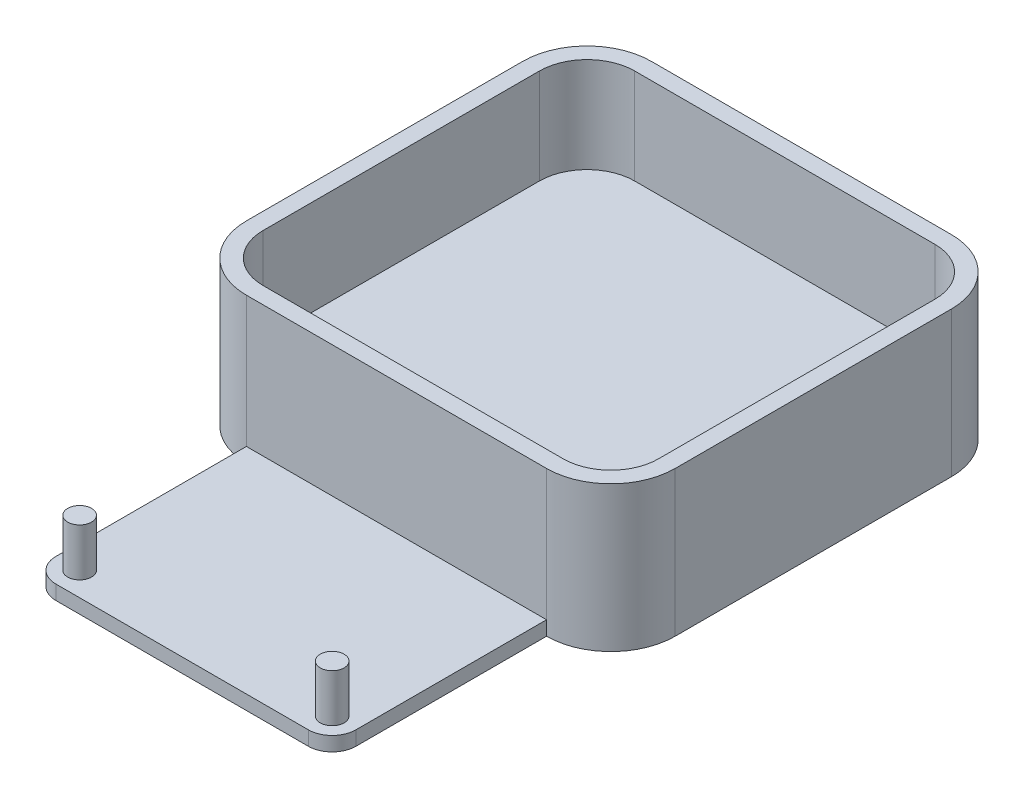
ISO-10303-21;
HEADER;
FILE_DESCRIPTION(('STEP AP214'),'2;1');
FILE_NAME('part.step','',(''),(''),'','','');
FILE_SCHEMA(('AUTOMOTIVE_DESIGN { 1 0 10303 214 1 1 1 1 }'));
ENDSEC;
DATA;
#1=APPLICATION_CONTEXT('core data for automotive mechanical design processes');
#2=APPLICATION_PROTOCOL_DEFINITION('international standard','automotive_design',2000,#1);
#3=PRODUCT_CONTEXT('',#1,'mechanical');
#4=PRODUCT('Part','Part','',(#3));
#5=PRODUCT_RELATED_PRODUCT_CATEGORY('part','',(#4));
#6=PRODUCT_DEFINITION_FORMATION('','',#4);
#7=PRODUCT_DEFINITION_CONTEXT('part definition',#1,'design');
#8=PRODUCT_DEFINITION('design','',#6,#7);
#9=PRODUCT_DEFINITION_SHAPE('','',#8);
#10=(LENGTH_UNIT() NAMED_UNIT(*) SI_UNIT(.MILLI.,.METRE.));
#11=(NAMED_UNIT(*) PLANE_ANGLE_UNIT() SI_UNIT($,.RADIAN.));
#12=(NAMED_UNIT(*) SI_UNIT($,.STERADIAN.) SOLID_ANGLE_UNIT());
#13=UNCERTAINTY_MEASURE_WITH_UNIT(LENGTH_MEASURE(1.E-05),#10,'distance_accuracy_value','');
#14=(GEOMETRIC_REPRESENTATION_CONTEXT(3) GLOBAL_UNCERTAINTY_ASSIGNED_CONTEXT((#13)) GLOBAL_UNIT_ASSIGNED_CONTEXT((#10,
#11,#12)) REPRESENTATION_CONTEXT('',''));
#15=CARTESIAN_POINT('',(0.,0.,0.));
#16=DIRECTION('',(0.,0.,1.));
#17=DIRECTION('',(1.,0.,0.));
#18=AXIS2_PLACEMENT_3D('',#15,#16,#17);
#19=CARTESIAN_POINT('',(0.,0.,0.));
#20=DIRECTION('',(0.,1.,0.));
#21=DIRECTION('',(0.,0.,1.));
#22=AXIS2_PLACEMENT_3D('',#19,#20,#21);
#23=PLANE('',#22);
#24=DIRECTION('',(0.,0.,1.));
#25=VECTOR('',#24,1.);
#26=CARTESIAN_POINT('',(76.5,0.,0.));
#27=LINE('',#26,#25);
#28=CARTESIAN_POINT('',(76.5,0.,0.));
#29=VERTEX_POINT('',#28);
#30=CARTESIAN_POINT('',(76.5,0.,40.));
#31=VERTEX_POINT('',#30);
#32=EDGE_CURVE('E268',#29,#31,#27,.T.);
#33=ORIENTED_EDGE('',*,*,#32,.T.);
#34=CARTESIAN_POINT('',(71.5,0.,40.));
#35=DIRECTION('',(0.,1.,0.));
#36=DIRECTION('',(0.,0.,1.));
#37=AXIS2_PLACEMENT_3D('',#34,#35,#36);
#38=CIRCLE('',#37,5.);
#39=CARTESIAN_POINT('',(71.5,0.,45.));
#40=VERTEX_POINT('',#39);
#41=EDGE_CURVE('E92',#31,#40,#38,.F.);
#42=ORIENTED_EDGE('',*,*,#41,.T.);
#43=DIRECTION('',(-1.,0.,0.));
#44=VECTOR('',#43,1.);
#45=CARTESIAN_POINT('',(13.5,0.,45.));
#46=LINE('',#45,#44);
#47=CARTESIAN_POINT('',(18.5,0.,45.));
#48=VERTEX_POINT('',#47);
#49=EDGE_CURVE('E286',#40,#48,#46,.T.);
#50=ORIENTED_EDGE('',*,*,#49,.T.);
#51=CARTESIAN_POINT('',(18.5,0.,40.));
#52=DIRECTION('',(0.,1.,0.));
#53=DIRECTION('',(0.,0.,1.));
#54=AXIS2_PLACEMENT_3D('',#51,#52,#53);
#55=CIRCLE('',#54,5.);
#56=CARTESIAN_POINT('',(13.5,0.,40.));
#57=VERTEX_POINT('',#56);
#58=EDGE_CURVE('E496',#48,#57,#55,.F.);
#59=ORIENTED_EDGE('',*,*,#58,.T.);
#60=DIRECTION('',(0.,0.,-1.));
#61=VECTOR('',#60,1.);
#62=CARTESIAN_POINT('',(13.5,0.,0.));
#63=LINE('',#62,#61);
#64=CARTESIAN_POINT('',(13.5,0.,0.));
#65=VERTEX_POINT('',#64);
#66=EDGE_CURVE('E280',#57,#65,#63,.T.);
#67=ORIENTED_EDGE('',*,*,#66,.T.);
#68=CARTESIAN_POINT('',(13.5,0.,-13.5));
#69=DIRECTION('',(0.,1.,0.));
#70=DIRECTION('',(0.,0.,1.));
#71=AXIS2_PLACEMENT_3D('',#68,#69,#70);
#72=CIRCLE('',#71,13.5);
#73=CARTESIAN_POINT('',(0.,0.,-13.5));
#74=VERTEX_POINT('',#73);
#75=EDGE_CURVE('E446',#65,#74,#72,.F.);
#76=ORIENTED_EDGE('',*,*,#75,.T.);
#77=DIRECTION('',(0.,0.,1.));
#78=VECTOR('',#77,1.);
#79=CARTESIAN_POINT('',(0.,0.,-85.));
#80=LINE('',#79,#78);
#81=CARTESIAN_POINT('',(0.,0.,-71.5));
#82=VERTEX_POINT('',#81);
#83=EDGE_CURVE('E378',#82,#74,#80,.T.);
#84=ORIENTED_EDGE('',*,*,#83,.F.);
#85=CARTESIAN_POINT('',(13.5,0.,-71.5));
#86=DIRECTION('',(0.,1.,0.));
#87=DIRECTION('',(0.,0.,1.));
#88=AXIS2_PLACEMENT_3D('',#85,#86,#87);
#89=CIRCLE('',#88,13.5);
#90=CARTESIAN_POINT('',(13.5,0.,-85.));
#91=VERTEX_POINT('',#90);
#92=EDGE_CURVE('E483',#82,#91,#89,.F.);
#93=ORIENTED_EDGE('',*,*,#92,.T.);
#94=DIRECTION('',(-1.,0.,0.));
#95=VECTOR('',#94,1.);
#96=CARTESIAN_POINT('',(0.,0.,-85.));
#97=LINE('',#96,#95);
#98=CARTESIAN_POINT('',(76.5,0.,-85.));
#99=VERTEX_POINT('',#98);
#100=EDGE_CURVE('E385',#99,#91,#97,.T.);
#101=ORIENTED_EDGE('',*,*,#100,.F.);
#102=CARTESIAN_POINT('',(76.5,0.,-71.5));
#103=DIRECTION('',(0.,1.,0.));
#104=DIRECTION('',(0.,0.,1.));
#105=AXIS2_PLACEMENT_3D('',#102,#103,#104);
#106=CIRCLE('',#105,13.5);
#107=CARTESIAN_POINT('',(90.,0.,-71.5));
#108=VERTEX_POINT('',#107);
#109=EDGE_CURVE('E469',#99,#108,#106,.F.);
#110=ORIENTED_EDGE('',*,*,#109,.T.);
#111=DIRECTION('',(0.,0.,-1.));
#112=VECTOR('',#111,1.);
#113=CARTESIAN_POINT('',(90.,0.,-85.));
#114=LINE('',#113,#112);
#115=CARTESIAN_POINT('',(90.,0.,-13.5));
#116=VERTEX_POINT('',#115);
#117=EDGE_CURVE('E381',#116,#108,#114,.T.);
#118=ORIENTED_EDGE('',*,*,#117,.F.);
#119=CARTESIAN_POINT('',(76.5,0.,-13.5));
#120=DIRECTION('',(0.,1.,0.));
#121=DIRECTION('',(0.,0.,1.));
#122=AXIS2_PLACEMENT_3D('',#119,#120,#121);
#123=CIRCLE('',#122,13.5);
#124=EDGE_CURVE('E248',#116,#29,#123,.F.);
#125=ORIENTED_EDGE('',*,*,#124,.T.);
#126=EDGE_LOOP('',(#33,#42,#50,#59,#67,#76,#84,#93,#101,#110,#118,#125));
#127=FACE_BOUND('',#126,.T.);
#128=DIRECTION('',(0.,0.,1.));
#129=VECTOR('',#128,1.);
#130=CARTESIAN_POINT('',(10.,0.,-50.));
#131=LINE('',#130,#129);
#132=CARTESIAN_POINT('',(10.,0.,-50.));
#133=VERTEX_POINT('',#132);
#134=CARTESIAN_POINT('',(10.,0.,-30.));
#135=VERTEX_POINT('',#134);
#136=EDGE_CURVE('E332',#133,#135,#131,.T.);
#137=ORIENTED_EDGE('',*,*,#136,.T.);
#138=DIRECTION('',(1.,0.,0.));
#139=VECTOR('',#138,1.);
#140=CARTESIAN_POINT('',(10.,0.,-30.));
#141=LINE('',#140,#139);
#142=CARTESIAN_POINT('',(80.,0.,-30.));
#143=VERTEX_POINT('',#142);
#144=EDGE_CURVE('E354',#135,#143,#141,.T.);
#145=ORIENTED_EDGE('',*,*,#144,.T.);
#146=DIRECTION('',(0.,0.,-1.));
#147=VECTOR('',#146,1.);
#148=CARTESIAN_POINT('',(80.,0.,-50.));
#149=LINE('',#148,#147);
#150=CARTESIAN_POINT('',(80.,0.,-50.));
#151=VERTEX_POINT('',#150);
#152=EDGE_CURVE('E358',#143,#151,#149,.T.);
#153=ORIENTED_EDGE('',*,*,#152,.T.);
#154=DIRECTION('',(-1.,0.,0.));
#155=VECTOR('',#154,1.);
#156=CARTESIAN_POINT('',(10.,0.,-50.));
#157=LINE('',#156,#155);
#158=EDGE_CURVE('E338',#151,#133,#157,.T.);
#159=ORIENTED_EDGE('',*,*,#158,.T.);
#160=EDGE_LOOP('',(#137,#145,#153,#159));
#161=FACE_BOUND('',#160,.T.);
#162=ADVANCED_FACE('F69',(#127,#161),#23,.F.);
#163=CARTESIAN_POINT('',(0.,7.5,-85.));
#164=DIRECTION('',(1.,0.,0.));
#165=DIRECTION('',(0.,0.,-1.));
#166=AXIS2_PLACEMENT_3D('',#163,#164,#165);
#167=PLANE('',#166);
#168=DIRECTION('',(0.,0.,1.));
#169=VECTOR('',#168,1.);
#170=CARTESIAN_POINT('',(0.,30.5,-85.));
#171=LINE('',#170,#169);
#172=CARTESIAN_POINT('',(0.,30.5,-71.5));
#173=VERTEX_POINT('',#172);
#174=CARTESIAN_POINT('',(0.,30.5,-13.5));
#175=VERTEX_POINT('',#174);
#176=EDGE_CURVE('E329',#173,#175,#171,.T.);
#177=ORIENTED_EDGE('',*,*,#176,.F.);
#178=DIRECTION('',(0.,-1.,0.));
#179=VECTOR('',#178,1.);
#180=CARTESIAN_POINT('',(0.,7.5,-71.5));
#181=LINE('',#180,#179);
#182=EDGE_CURVE('E479',#173,#82,#181,.T.);
#183=ORIENTED_EDGE('',*,*,#182,.T.);
#184=ORIENTED_EDGE('',*,*,#83,.T.);
#185=DIRECTION('',(0.,-1.,0.));
#186=VECTOR('',#185,1.);
#187=CARTESIAN_POINT('',(0.,7.5,-13.5));
#188=LINE('',#187,#186);
#189=EDGE_CURVE('E450',#74,#175,#188,.F.);
#190=ORIENTED_EDGE('',*,*,#189,.T.);
#191=EDGE_LOOP('',(#177,#183,#184,#190));
#192=FACE_BOUND('',#191,.T.);
#193=ADVANCED_FACE('F572',(#192),#167,.F.);
#194=CARTESIAN_POINT('',(0.,7.5,0.));
#195=DIRECTION('',(0.,0.,-1.));
#196=DIRECTION('',(-1.,0.,0.));
#197=AXIS2_PLACEMENT_3D('',#194,#195,#196);
#198=PLANE('',#197);
#199=DIRECTION('',(0.,-1.,0.));
#200=VECTOR('',#199,1.);
#201=CARTESIAN_POINT('',(13.5,7.5,0.));
#202=LINE('',#201,#200);
#203=CARTESIAN_POINT('',(13.5,30.5,0.));
#204=VERTEX_POINT('',#203);
#205=CARTESIAN_POINT('',(13.5,3.,0.));
#206=VERTEX_POINT('',#205);
#207=EDGE_CURVE('E255',#204,#206,#202,.T.);
#208=ORIENTED_EDGE('',*,*,#207,.T.);
#209=DIRECTION('',(1.,0.,0.));
#210=VECTOR('',#209,1.);
#211=CARTESIAN_POINT('',(13.5,3.,0.));
#212=LINE('',#211,#210);
#213=CARTESIAN_POINT('',(76.5,3.,0.));
#214=VERTEX_POINT('',#213);
#215=EDGE_CURVE('E252',#206,#214,#212,.T.);
#216=ORIENTED_EDGE('',*,*,#215,.T.);
#217=DIRECTION('',(0.,-1.,0.));
#218=VECTOR('',#217,1.);
#219=CARTESIAN_POINT('',(76.5,7.5,0.));
#220=LINE('',#219,#218);
#221=CARTESIAN_POINT('',(76.5,30.5,0.));
#222=VERTEX_POINT('',#221);
#223=EDGE_CURVE('E235',#214,#222,#220,.F.);
#224=ORIENTED_EDGE('',*,*,#223,.T.);
#225=DIRECTION('',(1.,0.,0.));
#226=VECTOR('',#225,1.);
#227=CARTESIAN_POINT('',(0.,30.5,0.));
#228=LINE('',#227,#226);
#229=EDGE_CURVE('E308',#204,#222,#228,.T.);
#230=ORIENTED_EDGE('',*,*,#229,.F.);
#231=EDGE_LOOP('',(#208,#216,#224,#230));
#232=FACE_BOUND('',#231,.T.);
#233=ADVANCED_FACE('F253',(#232),#198,.F.);
#234=CARTESIAN_POINT('',(90.,7.5,-85.));
#235=DIRECTION('',(-1.,0.,0.));
#236=DIRECTION('',(0.,0.,1.));
#237=AXIS2_PLACEMENT_3D('',#234,#235,#236);
#238=PLANE('',#237);
#239=ORIENTED_EDGE('',*,*,#117,.T.);
#240=DIRECTION('',(0.,-1.,0.));
#241=VECTOR('',#240,1.);
#242=CARTESIAN_POINT('',(90.,7.5,-71.5));
#243=LINE('',#242,#241);
#244=CARTESIAN_POINT('',(90.,30.5,-71.5));
#245=VERTEX_POINT('',#244);
#246=EDGE_CURVE('E472',#108,#245,#243,.F.);
#247=ORIENTED_EDGE('',*,*,#246,.T.);
#248=DIRECTION('',(0.,0.,1.));
#249=VECTOR('',#248,1.);
#250=CARTESIAN_POINT('',(90.,30.5,-85.));
#251=LINE('',#250,#249);
#252=CARTESIAN_POINT('',(90.,30.5,-13.5));
#253=VERTEX_POINT('',#252);
#254=EDGE_CURVE('E323',#245,#253,#251,.T.);
#255=ORIENTED_EDGE('',*,*,#254,.T.);
#256=DIRECTION('',(0.,-1.,0.));
#257=VECTOR('',#256,1.);
#258=CARTESIAN_POINT('',(90.,7.5,-13.5));
#259=LINE('',#258,#257);
#260=EDGE_CURVE('E457',#253,#116,#259,.T.);
#261=ORIENTED_EDGE('',*,*,#260,.T.);
#262=EDGE_LOOP('',(#239,#247,#255,#261));
#263=FACE_BOUND('',#262,.T.);
#264=ADVANCED_FACE('F515',(#263),#238,.F.);
#265=CARTESIAN_POINT('',(0.,7.5,-85.));
#266=DIRECTION('',(0.,0.,1.));
#267=DIRECTION('',(1.,0.,0.));
#268=AXIS2_PLACEMENT_3D('',#265,#266,#267);
#269=PLANE('',#268);
#270=ORIENTED_EDGE('',*,*,#100,.T.);
#271=DIRECTION('',(0.,-1.,0.));
#272=VECTOR('',#271,1.);
#273=CARTESIAN_POINT('',(13.5,7.5,-85.));
#274=LINE('',#273,#272);
#275=CARTESIAN_POINT('',(13.5,30.5,-85.));
#276=VERTEX_POINT('',#275);
#277=EDGE_CURVE('E486',#91,#276,#274,.F.);
#278=ORIENTED_EDGE('',*,*,#277,.T.);
#279=DIRECTION('',(1.,0.,0.));
#280=VECTOR('',#279,1.);
#281=CARTESIAN_POINT('',(0.,30.5,-85.));
#282=LINE('',#281,#280);
#283=CARTESIAN_POINT('',(76.5,30.5,-85.));
#284=VERTEX_POINT('',#283);
#285=EDGE_CURVE('E326',#276,#284,#282,.T.);
#286=ORIENTED_EDGE('',*,*,#285,.T.);
#287=DIRECTION('',(0.,-1.,0.));
#288=VECTOR('',#287,1.);
#289=CARTESIAN_POINT('',(76.5,7.5,-85.));
#290=LINE('',#289,#288);
#291=EDGE_CURVE('E465',#284,#99,#290,.T.);
#292=ORIENTED_EDGE('',*,*,#291,.T.);
#293=EDGE_LOOP('',(#270,#278,#286,#292));
#294=FACE_BOUND('',#293,.T.);
#295=ADVANCED_FACE('F585',(#294),#269,.F.);
#296=CARTESIAN_POINT('',(10.,7.5,-50.));
#297=DIRECTION('',(1.,0.,0.));
#298=DIRECTION('',(0.,0.,-1.));
#299=AXIS2_PLACEMENT_3D('',#296,#297,#298);
#300=PLANE('',#299);
#301=ORIENTED_EDGE('',*,*,#136,.F.);
#302=DIRECTION('',(0.,-1.,0.));
#303=VECTOR('',#302,1.);
#304=CARTESIAN_POINT('',(10.,7.5,-50.));
#305=LINE('',#304,#303);
#306=CARTESIAN_POINT('',(10.,7.5,-50.));
#307=VERTEX_POINT('',#306);
#308=EDGE_CURVE('E350',#307,#133,#305,.T.);
#309=ORIENTED_EDGE('',*,*,#308,.F.);
#310=DIRECTION('',(0.,0.,1.));
#311=VECTOR('',#310,1.);
#312=CARTESIAN_POINT('',(10.,7.5,-50.));
#313=LINE('',#312,#311);
#314=CARTESIAN_POINT('',(10.,7.5,-30.));
#315=VERTEX_POINT('',#314);
#316=EDGE_CURVE('E333',#307,#315,#313,.T.);
#317=ORIENTED_EDGE('',*,*,#316,.T.);
#318=DIRECTION('',(0.,-1.,0.));
#319=VECTOR('',#318,1.);
#320=CARTESIAN_POINT('',(10.,7.5,-30.));
#321=LINE('',#320,#319);
#322=EDGE_CURVE('E374',#315,#135,#321,.T.);
#323=ORIENTED_EDGE('',*,*,#322,.T.);
#324=EDGE_LOOP('',(#301,#309,#317,#323));
#325=FACE_BOUND('',#324,.T.);
#326=ADVANCED_FACE('F583',(#325),#300,.T.);
#327=CARTESIAN_POINT('',(10.,7.5,-30.));
#328=DIRECTION('',(0.,0.,-1.));
#329=DIRECTION('',(-1.,0.,0.));
#330=AXIS2_PLACEMENT_3D('',#327,#328,#329);
#331=PLANE('',#330);
#332=ORIENTED_EDGE('',*,*,#144,.F.);
#333=ORIENTED_EDGE('',*,*,#322,.F.);
#334=DIRECTION('',(1.,0.,0.));
#335=VECTOR('',#334,1.);
#336=CARTESIAN_POINT('',(10.,7.5,-30.));
#337=LINE('',#336,#335);
#338=CARTESIAN_POINT('',(80.,7.5,-30.));
#339=VERTEX_POINT('',#338);
#340=EDGE_CURVE('E337',#315,#339,#337,.T.);
#341=ORIENTED_EDGE('',*,*,#340,.T.);
#342=DIRECTION('',(0.,-1.,0.));
#343=VECTOR('',#342,1.);
#344=CARTESIAN_POINT('',(80.,7.5,-30.));
#345=LINE('',#344,#343);
#346=EDGE_CURVE('E371',#339,#143,#345,.T.);
#347=ORIENTED_EDGE('',*,*,#346,.T.);
#348=EDGE_LOOP('',(#332,#333,#341,#347));
#349=FACE_BOUND('',#348,.T.);
#350=ADVANCED_FACE('F674',(#349),#331,.T.);
#351=CARTESIAN_POINT('',(80.,7.5,-50.));
#352=DIRECTION('',(-1.,0.,0.));
#353=DIRECTION('',(0.,0.,1.));
#354=AXIS2_PLACEMENT_3D('',#351,#352,#353);
#355=PLANE('',#354);
#356=ORIENTED_EDGE('',*,*,#152,.F.);
#357=ORIENTED_EDGE('',*,*,#346,.F.);
#358=DIRECTION('',(0.,0.,-1.));
#359=VECTOR('',#358,1.);
#360=CARTESIAN_POINT('',(80.,7.5,-50.));
#361=LINE('',#360,#359);
#362=CARTESIAN_POINT('',(80.,7.5,-50.));
#363=VERTEX_POINT('',#362);
#364=EDGE_CURVE('E342',#339,#363,#361,.T.);
#365=ORIENTED_EDGE('',*,*,#364,.T.);
#366=DIRECTION('',(0.,-1.,0.));
#367=VECTOR('',#366,1.);
#368=CARTESIAN_POINT('',(80.,7.5,-50.));
#369=LINE('',#368,#367);
#370=EDGE_CURVE('E368',#363,#151,#369,.T.);
#371=ORIENTED_EDGE('',*,*,#370,.T.);
#372=EDGE_LOOP('',(#356,#357,#365,#371));
#373=FACE_BOUND('',#372,.T.);
#374=ADVANCED_FACE('F671',(#373),#355,.T.);
#375=CARTESIAN_POINT('',(10.,7.5,-50.));
#376=DIRECTION('',(0.,0.,1.));
#377=DIRECTION('',(1.,0.,0.));
#378=AXIS2_PLACEMENT_3D('',#375,#376,#377);
#379=PLANE('',#378);
#380=ORIENTED_EDGE('',*,*,#158,.F.);
#381=ORIENTED_EDGE('',*,*,#370,.F.);
#382=DIRECTION('',(-1.,0.,0.));
#383=VECTOR('',#382,1.);
#384=CARTESIAN_POINT('',(10.,7.5,-50.));
#385=LINE('',#384,#383);
#386=EDGE_CURVE('E346',#363,#307,#385,.T.);
#387=ORIENTED_EDGE('',*,*,#386,.T.);
#388=ORIENTED_EDGE('',*,*,#308,.T.);
#389=EDGE_LOOP('',(#380,#381,#387,#388));
#390=FACE_BOUND('',#389,.T.);
#391=ADVANCED_FACE('F667',(#390),#379,.T.);
#392=CARTESIAN_POINT('',(0.,7.5,0.));
#393=DIRECTION('',(0.,1.,0.));
#394=DIRECTION('',(0.,0.,1.));
#395=AXIS2_PLACEMENT_3D('',#392,#393,#394);
#396=PLANE('',#395);
#397=ORIENTED_EDGE('',*,*,#340,.F.);
#398=ORIENTED_EDGE('',*,*,#316,.F.);
#399=ORIENTED_EDGE('',*,*,#386,.F.);
#400=ORIENTED_EDGE('',*,*,#364,.F.);
#401=EDGE_LOOP('',(#397,#398,#399,#400));
#402=FACE_BOUND('',#401,.T.);
#403=ADVANCED_FACE('F660',(#402),#396,.F.);
#404=CARTESIAN_POINT('',(0.,30.5,0.));
#405=DIRECTION('',(0.,-1.,0.));
#406=DIRECTION('',(0.,0.,-1.));
#407=AXIS2_PLACEMENT_3D('',#404,#405,#406);
#408=PLANE('',#407);
#409=DIRECTION('',(1.,0.,0.));
#410=VECTOR('',#409,1.);
#411=CARTESIAN_POINT('',(3.5,30.5,-3.5));
#412=LINE('',#411,#410);
#413=CARTESIAN_POINT('',(13.5,30.5,-3.5));
#414=VERTEX_POINT('',#413);
#415=CARTESIAN_POINT('',(76.5,30.5,-3.5));
#416=VERTEX_POINT('',#415);
#417=EDGE_CURVE('E301',#414,#416,#412,.T.);
#418=ORIENTED_EDGE('',*,*,#417,.F.);
#419=CARTESIAN_POINT('',(13.5,30.5,-13.5));
#420=DIRECTION('',(0.,-1.,0.));
#421=DIRECTION('',(0.,0.,-1.));
#422=AXIS2_PLACEMENT_3D('',#419,#420,#421);
#423=CIRCLE('',#422,10.);
#424=CARTESIAN_POINT('',(3.5,30.5,-13.5));
#425=VERTEX_POINT('',#424);
#426=EDGE_CURVE('E428',#414,#425,#423,.T.);
#427=ORIENTED_EDGE('',*,*,#426,.T.);
#428=DIRECTION('',(0.,0.,-1.));
#429=VECTOR('',#428,1.);
#430=CARTESIAN_POINT('',(3.5,30.5,-3.5));
#431=LINE('',#430,#429);
#432=CARTESIAN_POINT('',(3.5,30.5,-71.5));
#433=VERTEX_POINT('',#432);
#434=EDGE_CURVE('E305',#425,#433,#431,.T.);
#435=ORIENTED_EDGE('',*,*,#434,.T.);
#436=CARTESIAN_POINT('',(13.5,30.5,-71.5));
#437=DIRECTION('',(0.,-1.,0.));
#438=DIRECTION('',(0.,0.,-1.));
#439=AXIS2_PLACEMENT_3D('',#436,#437,#438);
#440=CIRCLE('',#439,10.);
#441=CARTESIAN_POINT('',(13.5,30.5,-81.5));
#442=VERTEX_POINT('',#441);
#443=EDGE_CURVE('E401',#433,#442,#440,.T.);
#444=ORIENTED_EDGE('',*,*,#443,.T.);
#445=DIRECTION('',(1.,0.,0.));
#446=VECTOR('',#445,1.);
#447=CARTESIAN_POINT('',(3.5,30.5,-81.5));
#448=LINE('',#447,#446);
#449=CARTESIAN_POINT('',(76.5,30.5,-81.5));
#450=VERTEX_POINT('',#449);
#451=EDGE_CURVE('E293',#442,#450,#448,.T.);
#452=ORIENTED_EDGE('',*,*,#451,.T.);
#453=CARTESIAN_POINT('',(76.5,30.5,-71.5));
#454=DIRECTION('',(0.,-1.,0.));
#455=DIRECTION('',(0.,0.,-1.));
#456=AXIS2_PLACEMENT_3D('',#453,#454,#455);
#457=CIRCLE('',#456,10.);
#458=CARTESIAN_POINT('',(86.5,30.5,-71.5));
#459=VERTEX_POINT('',#458);
#460=EDGE_CURVE('E414',#450,#459,#457,.T.);
#461=ORIENTED_EDGE('',*,*,#460,.T.);
#462=DIRECTION('',(0.,0.,-1.));
#463=VECTOR('',#462,1.);
#464=CARTESIAN_POINT('',(86.5,30.5,-3.5));
#465=LINE('',#464,#463);
#466=CARTESIAN_POINT('',(86.5,30.5,-13.5));
#467=VERTEX_POINT('',#466);
#468=EDGE_CURVE('E297',#467,#459,#465,.T.);
#469=ORIENTED_EDGE('',*,*,#468,.F.);
#470=CARTESIAN_POINT('',(76.5,30.5,-13.5));
#471=DIRECTION('',(0.,-1.,0.));
#472=DIRECTION('',(0.,0.,-1.));
#473=AXIS2_PLACEMENT_3D('',#470,#471,#472);
#474=CIRCLE('',#473,10.);
#475=EDGE_CURVE('E441',#467,#416,#474,.T.);
#476=ORIENTED_EDGE('',*,*,#475,.T.);
#477=EDGE_LOOP('',(#418,#427,#435,#444,#452,#461,#469,#476));
#478=FACE_BOUND('',#477,.T.);
#479=ORIENTED_EDGE('',*,*,#285,.F.);
#480=CARTESIAN_POINT('',(13.5,30.5,-71.5));
#481=DIRECTION('',(0.,-1.,0.));
#482=DIRECTION('',(0.,0.,-1.));
#483=AXIS2_PLACEMENT_3D('',#480,#481,#482);
#484=CIRCLE('',#483,13.5);
#485=EDGE_CURVE('E489',#276,#173,#484,.F.);
#486=ORIENTED_EDGE('',*,*,#485,.T.);
#487=ORIENTED_EDGE('',*,*,#176,.T.);
#488=CARTESIAN_POINT('',(13.5,30.5,-13.5));
#489=DIRECTION('',(0.,-1.,0.));
#490=DIRECTION('',(0.,0.,-1.));
#491=AXIS2_PLACEMENT_3D('',#488,#489,#490);
#492=CIRCLE('',#491,13.5);
#493=EDGE_CURVE('E454',#175,#204,#492,.F.);
#494=ORIENTED_EDGE('',*,*,#493,.T.);
#495=ORIENTED_EDGE('',*,*,#229,.T.);
#496=CARTESIAN_POINT('',(76.5,30.5,-13.5));
#497=DIRECTION('',(0.,-1.,0.));
#498=DIRECTION('',(0.,0.,-1.));
#499=AXIS2_PLACEMENT_3D('',#496,#497,#498);
#500=CIRCLE('',#499,13.5);
#501=EDGE_CURVE('E243',#222,#253,#500,.F.);
#502=ORIENTED_EDGE('',*,*,#501,.T.);
#503=ORIENTED_EDGE('',*,*,#254,.F.);
#504=CARTESIAN_POINT('',(76.5,30.5,-71.5));
#505=DIRECTION('',(0.,-1.,0.));
#506=DIRECTION('',(0.,0.,-1.));
#507=AXIS2_PLACEMENT_3D('',#504,#505,#506);
#508=CIRCLE('',#507,13.5);
#509=EDGE_CURVE('E475',#245,#284,#508,.F.);
#510=ORIENTED_EDGE('',*,*,#509,.T.);
#511=EDGE_LOOP('',(#479,#486,#487,#494,#495,#502,#503,#510));
#512=FACE_BOUND('',#511,.T.);
#513=ADVANCED_FACE('F521',(#478,#512),#408,.F.);
#514=CARTESIAN_POINT('',(3.5,30.5,-81.5));
#515=DIRECTION('',(0.,0.,-1.));
#516=DIRECTION('',(-1.,0.,0.));
#517=AXIS2_PLACEMENT_3D('',#514,#515,#516);
#518=PLANE('',#517);
#519=DIRECTION('',(1.,0.,0.));
#520=VECTOR('',#519,1.);
#521=CARTESIAN_POINT('',(3.5,10.5,-81.5));
#522=LINE('',#521,#520);
#523=CARTESIAN_POINT('',(13.5,10.5,-81.5));
#524=VERTEX_POINT('',#523);
#525=CARTESIAN_POINT('',(76.5,10.5,-81.5));
#526=VERTEX_POINT('',#525);
#527=EDGE_CURVE('E292',#524,#526,#522,.T.);
#528=ORIENTED_EDGE('',*,*,#527,.T.);
#529=DIRECTION('',(0.,-1.,0.));
#530=VECTOR('',#529,1.);
#531=CARTESIAN_POINT('',(76.5,30.5,-81.5));
#532=LINE('',#531,#530);
#533=EDGE_CURVE('E411',#526,#450,#532,.F.);
#534=ORIENTED_EDGE('',*,*,#533,.T.);
#535=ORIENTED_EDGE('',*,*,#451,.F.);
#536=DIRECTION('',(0.,-1.,0.));
#537=VECTOR('',#536,1.);
#538=CARTESIAN_POINT('',(13.5,10.5,-81.5));
#539=LINE('',#538,#537);
#540=EDGE_CURVE('E389',#442,#524,#539,.T.);
#541=ORIENTED_EDGE('',*,*,#540,.T.);
#542=EDGE_LOOP('',(#528,#534,#535,#541));
#543=FACE_BOUND('',#542,.T.);
#544=ADVANCED_FACE('F646',(#543),#518,.F.);
#545=CARTESIAN_POINT('',(3.5,30.5,-3.5));
#546=DIRECTION('',(-1.,0.,0.));
#547=DIRECTION('',(0.,0.,1.));
#548=AXIS2_PLACEMENT_3D('',#545,#546,#547);
#549=PLANE('',#548);
#550=ORIENTED_EDGE('',*,*,#434,.F.);
#551=DIRECTION('',(0.,-1.,0.));
#552=VECTOR('',#551,1.);
#553=CARTESIAN_POINT('',(3.5,30.5,-13.5));
#554=LINE('',#553,#552);
#555=CARTESIAN_POINT('',(3.5,10.5,-13.5));
#556=VERTEX_POINT('',#555);
#557=EDGE_CURVE('E418',#425,#556,#554,.T.);
#558=ORIENTED_EDGE('',*,*,#557,.T.);
#559=DIRECTION('',(0.,0.,-1.));
#560=VECTOR('',#559,1.);
#561=CARTESIAN_POINT('',(3.5,10.5,-3.5));
#562=LINE('',#561,#560);
#563=CARTESIAN_POINT('',(3.5,10.5,-71.5));
#564=VERTEX_POINT('',#563);
#565=EDGE_CURVE('E298',#556,#564,#562,.T.);
#566=ORIENTED_EDGE('',*,*,#565,.T.);
#567=DIRECTION('',(0.,-1.,0.));
#568=VECTOR('',#567,1.);
#569=CARTESIAN_POINT('',(3.5,30.5,-71.5));
#570=LINE('',#569,#568);
#571=EDGE_CURVE('E397',#564,#433,#570,.F.);
#572=ORIENTED_EDGE('',*,*,#571,.T.);
#573=EDGE_LOOP('',(#550,#558,#566,#572));
#574=FACE_BOUND('',#573,.T.);
#575=ADVANCED_FACE('F642',(#574),#549,.F.);
#576=CARTESIAN_POINT('',(3.5,30.5,-3.5));
#577=DIRECTION('',(0.,0.,-1.));
#578=DIRECTION('',(-1.,0.,0.));
#579=AXIS2_PLACEMENT_3D('',#576,#577,#578);
#580=PLANE('',#579);
#581=ORIENTED_EDGE('',*,*,#417,.T.);
#582=DIRECTION('',(0.,-1.,0.));
#583=VECTOR('',#582,1.);
#584=CARTESIAN_POINT('',(76.5,10.5,-3.5));
#585=LINE('',#584,#583);
#586=CARTESIAN_POINT('',(76.5,10.5,-3.5));
#587=VERTEX_POINT('',#586);
#588=EDGE_CURVE('E431',#416,#587,#585,.T.);
#589=ORIENTED_EDGE('',*,*,#588,.T.);
#590=DIRECTION('',(1.,0.,0.));
#591=VECTOR('',#590,1.);
#592=CARTESIAN_POINT('',(3.5,10.5,-3.5));
#593=LINE('',#592,#591);
#594=CARTESIAN_POINT('',(13.5,10.5,-3.5));
#595=VERTEX_POINT('',#594);
#596=EDGE_CURVE('E315',#595,#587,#593,.T.);
#597=ORIENTED_EDGE('',*,*,#596,.F.);
#598=DIRECTION('',(0.,-1.,0.));
#599=VECTOR('',#598,1.);
#600=CARTESIAN_POINT('',(13.5,30.5,-3.5));
#601=LINE('',#600,#599);
#602=EDGE_CURVE('E425',#595,#414,#601,.F.);
#603=ORIENTED_EDGE('',*,*,#602,.T.);
#604=EDGE_LOOP('',(#581,#589,#597,#603));
#605=FACE_BOUND('',#604,.T.);
#606=ADVANCED_FACE('F645',(#605),#580,.T.);
#607=CARTESIAN_POINT('',(86.5,30.5,-3.5));
#608=DIRECTION('',(-1.,0.,0.));
#609=DIRECTION('',(0.,0.,1.));
#610=AXIS2_PLACEMENT_3D('',#607,#608,#609);
#611=PLANE('',#610);
#612=DIRECTION('',(0.,0.,-1.));
#613=VECTOR('',#612,1.);
#614=CARTESIAN_POINT('',(86.5,10.5,-3.5));
#615=LINE('',#614,#613);
#616=CARTESIAN_POINT('',(86.5,10.5,-13.5));
#617=VERTEX_POINT('',#616);
#618=CARTESIAN_POINT('',(86.5,10.5,-71.5));
#619=VERTEX_POINT('',#618);
#620=EDGE_CURVE('E312',#617,#619,#615,.T.);
#621=ORIENTED_EDGE('',*,*,#620,.F.);
#622=DIRECTION('',(0.,-1.,0.));
#623=VECTOR('',#622,1.);
#624=CARTESIAN_POINT('',(86.5,30.5,-13.5));
#625=LINE('',#624,#623);
#626=EDGE_CURVE('E438',#617,#467,#625,.F.);
#627=ORIENTED_EDGE('',*,*,#626,.T.);
#628=ORIENTED_EDGE('',*,*,#468,.T.);
#629=DIRECTION('',(0.,-1.,0.));
#630=VECTOR('',#629,1.);
#631=CARTESIAN_POINT('',(86.5,30.5,-71.5));
#632=LINE('',#631,#630);
#633=EDGE_CURVE('E404',#459,#619,#632,.T.);
#634=ORIENTED_EDGE('',*,*,#633,.T.);
#635=EDGE_LOOP('',(#621,#627,#628,#634));
#636=FACE_BOUND('',#635,.T.);
#637=ADVANCED_FACE('F650',(#636),#611,.T.);
#638=CARTESIAN_POINT('',(0.,10.5,0.));
#639=DIRECTION('',(0.,1.,0.));
#640=DIRECTION('',(0.,0.,1.));
#641=AXIS2_PLACEMENT_3D('',#638,#639,#640);
#642=PLANE('',#641);
#643=ORIENTED_EDGE('',*,*,#596,.T.);
#644=CARTESIAN_POINT('',(76.5,10.5,-13.5));
#645=DIRECTION('',(0.,1.,0.));
#646=DIRECTION('',(0.,0.,1.));
#647=AXIS2_PLACEMENT_3D('',#644,#645,#646);
#648=CIRCLE('',#647,10.);
#649=EDGE_CURVE('E435',#587,#617,#648,.T.);
#650=ORIENTED_EDGE('',*,*,#649,.T.);
#651=ORIENTED_EDGE('',*,*,#620,.T.);
#652=CARTESIAN_POINT('',(76.5,10.5,-71.5));
#653=DIRECTION('',(0.,1.,0.));
#654=DIRECTION('',(0.,0.,1.));
#655=AXIS2_PLACEMENT_3D('',#652,#653,#654);
#656=CIRCLE('',#655,10.);
#657=EDGE_CURVE('E408',#619,#526,#656,.T.);
#658=ORIENTED_EDGE('',*,*,#657,.T.);
#659=ORIENTED_EDGE('',*,*,#527,.F.);
#660=CARTESIAN_POINT('',(13.5,10.5,-71.5));
#661=DIRECTION('',(0.,1.,0.));
#662=DIRECTION('',(0.,0.,1.));
#663=AXIS2_PLACEMENT_3D('',#660,#661,#662);
#664=CIRCLE('',#663,10.);
#665=EDGE_CURVE('E393',#524,#564,#664,.T.);
#666=ORIENTED_EDGE('',*,*,#665,.T.);
#667=ORIENTED_EDGE('',*,*,#565,.F.);
#668=CARTESIAN_POINT('',(13.5,10.5,-13.5));
#669=DIRECTION('',(0.,1.,0.));
#670=DIRECTION('',(0.,0.,1.));
#671=AXIS2_PLACEMENT_3D('',#668,#669,#670);
#672=CIRCLE('',#671,10.);
#673=EDGE_CURVE('E422',#556,#595,#672,.T.);
#674=ORIENTED_EDGE('',*,*,#673,.T.);
#675=EDGE_LOOP('',(#643,#650,#651,#658,#659,#666,#667,#674));
#676=FACE_BOUND('',#675,.T.);
#677=ADVANCED_FACE('F597',(#676),#642,.T.);
#678=CARTESIAN_POINT('',(13.5,30.5,-71.5));
#679=DIRECTION('',(0.,1.,0.));
#680=DIRECTION('',(0.,0.,1.));
#681=AXIS2_PLACEMENT_3D('',#678,#679,#680);
#682=CYLINDRICAL_SURFACE('',#681,10.);
#683=ORIENTED_EDGE('',*,*,#443,.F.);
#684=ORIENTED_EDGE('',*,*,#571,.F.);
#685=ORIENTED_EDGE('',*,*,#665,.F.);
#686=ORIENTED_EDGE('',*,*,#540,.F.);
#687=EDGE_LOOP('',(#683,#684,#685,#686));
#688=FACE_BOUND('',#687,.T.);
#689=ADVANCED_FACE('F593',(#688),#682,.F.);
#690=CARTESIAN_POINT('',(76.5,30.5,-71.5));
#691=DIRECTION('',(0.,-1.,0.));
#692=DIRECTION('',(0.,0.,-1.));
#693=AXIS2_PLACEMENT_3D('',#690,#691,#692);
#694=CYLINDRICAL_SURFACE('',#693,10.);
#695=ORIENTED_EDGE('',*,*,#460,.F.);
#696=ORIENTED_EDGE('',*,*,#533,.F.);
#697=ORIENTED_EDGE('',*,*,#657,.F.);
#698=ORIENTED_EDGE('',*,*,#633,.F.);
#699=EDGE_LOOP('',(#695,#696,#697,#698));
#700=FACE_BOUND('',#699,.T.);
#701=ADVANCED_FACE('F596',(#700),#694,.F.);
#702=CARTESIAN_POINT('',(13.5,30.5,-13.5));
#703=DIRECTION('',(0.,-1.,0.));
#704=DIRECTION('',(0.,0.,-1.));
#705=AXIS2_PLACEMENT_3D('',#702,#703,#704);
#706=CYLINDRICAL_SURFACE('',#705,10.);
#707=ORIENTED_EDGE('',*,*,#426,.F.);
#708=ORIENTED_EDGE('',*,*,#602,.F.);
#709=ORIENTED_EDGE('',*,*,#673,.F.);
#710=ORIENTED_EDGE('',*,*,#557,.F.);
#711=EDGE_LOOP('',(#707,#708,#709,#710));
#712=FACE_BOUND('',#711,.T.);
#713=ADVANCED_FACE('F601',(#712),#706,.F.);
#714=CARTESIAN_POINT('',(76.5,30.5,-13.5));
#715=DIRECTION('',(0.,1.,0.));
#716=DIRECTION('',(0.,0.,1.));
#717=AXIS2_PLACEMENT_3D('',#714,#715,#716);
#718=CYLINDRICAL_SURFACE('',#717,10.);
#719=ORIENTED_EDGE('',*,*,#475,.F.);
#720=ORIENTED_EDGE('',*,*,#626,.F.);
#721=ORIENTED_EDGE('',*,*,#649,.F.);
#722=ORIENTED_EDGE('',*,*,#588,.F.);
#723=EDGE_LOOP('',(#719,#720,#721,#722));
#724=FACE_BOUND('',#723,.T.);
#725=ADVANCED_FACE('F605',(#724),#718,.F.);
#726=CARTESIAN_POINT('',(13.5,7.5,-13.5));
#727=DIRECTION('',(0.,-1.,0.));
#728=DIRECTION('',(0.,0.,-1.));
#729=AXIS2_PLACEMENT_3D('',#726,#727,#728);
#730=CYLINDRICAL_SURFACE('',#729,13.5);
#731=ORIENTED_EDGE('',*,*,#493,.F.);
#732=ORIENTED_EDGE('',*,*,#189,.F.);
#733=ORIENTED_EDGE('',*,*,#75,.F.);
#734=DIRECTION('',(0.,-1.,0.));
#735=VECTOR('',#734,1.);
#736=CARTESIAN_POINT('',(13.5,3.,0.));
#737=LINE('',#736,#735);
#738=EDGE_CURVE('E276',#206,#65,#737,.T.);
#739=ORIENTED_EDGE('',*,*,#738,.F.);
#740=ORIENTED_EDGE('',*,*,#207,.F.);
#741=EDGE_LOOP('',(#731,#732,#733,#739,#740));
#742=FACE_BOUND('',#741,.T.);
#743=ADVANCED_FACE('F525',(#742),#730,.T.);
#744=CARTESIAN_POINT('',(76.5,7.5,-13.5));
#745=DIRECTION('',(0.,-1.,0.));
#746=DIRECTION('',(0.,0.,-1.));
#747=AXIS2_PLACEMENT_3D('',#744,#745,#746);
#748=CYLINDRICAL_SURFACE('',#747,13.5);
#749=ORIENTED_EDGE('',*,*,#501,.F.);
#750=ORIENTED_EDGE('',*,*,#223,.F.);
#751=EDGE_CURVE('E239',#29,#214,#220,.F.);
#752=ORIENTED_EDGE('',*,*,#751,.F.);
#753=ORIENTED_EDGE('',*,*,#124,.F.);
#754=ORIENTED_EDGE('',*,*,#260,.F.);
#755=EDGE_LOOP('',(#749,#750,#752,#753,#754));
#756=FACE_BOUND('',#755,.T.);
#757=ADVANCED_FACE('F237',(#756),#748,.T.);
#758=CARTESIAN_POINT('',(76.5,7.5,-71.5));
#759=DIRECTION('',(0.,-1.,0.));
#760=DIRECTION('',(0.,0.,-1.));
#761=AXIS2_PLACEMENT_3D('',#758,#759,#760);
#762=CYLINDRICAL_SURFACE('',#761,13.5);
#763=ORIENTED_EDGE('',*,*,#509,.F.);
#764=ORIENTED_EDGE('',*,*,#246,.F.);
#765=ORIENTED_EDGE('',*,*,#109,.F.);
#766=ORIENTED_EDGE('',*,*,#291,.F.);
#767=EDGE_LOOP('',(#763,#764,#765,#766));
#768=FACE_BOUND('',#767,.T.);
#769=ADVANCED_FACE('F614',(#768),#762,.T.);
#770=CARTESIAN_POINT('',(13.5,7.5,-71.5));
#771=DIRECTION('',(0.,-1.,0.));
#772=DIRECTION('',(0.,0.,-1.));
#773=AXIS2_PLACEMENT_3D('',#770,#771,#772);
#774=CYLINDRICAL_SURFACE('',#773,13.5);
#775=ORIENTED_EDGE('',*,*,#485,.F.);
#776=ORIENTED_EDGE('',*,*,#277,.F.);
#777=ORIENTED_EDGE('',*,*,#92,.F.);
#778=ORIENTED_EDGE('',*,*,#182,.F.);
#779=EDGE_LOOP('',(#775,#776,#777,#778));
#780=FACE_BOUND('',#779,.T.);
#781=ADVANCED_FACE('F617',(#780),#774,.T.);
#782=CARTESIAN_POINT('',(13.5,3.,0.));
#783=DIRECTION('',(-1.,0.,0.));
#784=DIRECTION('',(0.,0.,1.));
#785=AXIS2_PLACEMENT_3D('',#782,#783,#784);
#786=PLANE('',#785);
#787=ORIENTED_EDGE('',*,*,#66,.F.);
#788=DIRECTION('',(0.,-1.,0.));
#789=VECTOR('',#788,1.);
#790=CARTESIAN_POINT('',(13.5,3.,40.));
#791=LINE('',#790,#789);
#792=CARTESIAN_POINT('',(13.5,3.,40.));
#793=VERTEX_POINT('',#792);
#794=EDGE_CURVE('E499',#57,#793,#791,.F.);
#795=ORIENTED_EDGE('',*,*,#794,.T.);
#796=DIRECTION('',(0.,0.,-1.));
#797=VECTOR('',#796,1.);
#798=CARTESIAN_POINT('',(13.5,3.,0.));
#799=LINE('',#798,#797);
#800=EDGE_CURVE('E261',#793,#206,#799,.T.);
#801=ORIENTED_EDGE('',*,*,#800,.T.);
#802=ORIENTED_EDGE('',*,*,#738,.T.);
#803=EDGE_LOOP('',(#787,#795,#801,#802));
#804=FACE_BOUND('',#803,.T.);
#805=ADVANCED_FACE('F530',(#804),#786,.T.);
#806=CARTESIAN_POINT('',(13.5,3.,45.));
#807=DIRECTION('',(0.,0.,1.));
#808=DIRECTION('',(1.,0.,0.));
#809=AXIS2_PLACEMENT_3D('',#806,#807,#808);
#810=PLANE('',#809);
#811=ORIENTED_EDGE('',*,*,#49,.F.);
#812=DIRECTION('',(0.,-1.,0.));
#813=VECTOR('',#812,1.);
#814=CARTESIAN_POINT('',(71.5,3.,45.));
#815=LINE('',#814,#813);
#816=CARTESIAN_POINT('',(71.5,3.,45.));
#817=VERTEX_POINT('',#816);
#818=EDGE_CURVE('E78',#40,#817,#815,.F.);
#819=ORIENTED_EDGE('',*,*,#818,.T.);
#820=DIRECTION('',(-1.,0.,0.));
#821=VECTOR('',#820,1.);
#822=CARTESIAN_POINT('',(13.5,3.,45.));
#823=LINE('',#822,#821);
#824=CARTESIAN_POINT('',(18.5,3.,45.));
#825=VERTEX_POINT('',#824);
#826=EDGE_CURVE('E273',#817,#825,#823,.T.);
#827=ORIENTED_EDGE('',*,*,#826,.T.);
#828=DIRECTION('',(0.,-1.,0.));
#829=VECTOR('',#828,1.);
#830=CARTESIAN_POINT('',(18.5,3.,45.));
#831=LINE('',#830,#829);
#832=EDGE_CURVE('E492',#825,#48,#831,.T.);
#833=ORIENTED_EDGE('',*,*,#832,.T.);
#834=EDGE_LOOP('',(#811,#819,#827,#833));
#835=FACE_BOUND('',#834,.T.);
#836=ADVANCED_FACE('F627',(#835),#810,.T.);
#837=CARTESIAN_POINT('',(76.5,3.,0.));
#838=DIRECTION('',(1.,0.,0.));
#839=DIRECTION('',(0.,0.,-1.));
#840=AXIS2_PLACEMENT_3D('',#837,#838,#839);
#841=PLANE('',#840);
#842=DIRECTION('',(0.,0.,1.));
#843=VECTOR('',#842,1.);
#844=CARTESIAN_POINT('',(76.5,3.,0.));
#845=LINE('',#844,#843);
#846=CARTESIAN_POINT('',(76.5,3.,40.));
#847=VERTEX_POINT('',#846);
#848=EDGE_CURVE('E260',#214,#847,#845,.T.);
#849=ORIENTED_EDGE('',*,*,#848,.T.);
#850=DIRECTION('',(0.,-1.,0.));
#851=VECTOR('',#850,1.);
#852=CARTESIAN_POINT('',(76.5,3.,40.));
#853=LINE('',#852,#851);
#854=EDGE_CURVE('E506',#847,#31,#853,.T.);
#855=ORIENTED_EDGE('',*,*,#854,.T.);
#856=ORIENTED_EDGE('',*,*,#32,.F.);
#857=ORIENTED_EDGE('',*,*,#751,.T.);
#858=EDGE_LOOP('',(#849,#855,#856,#857));
#859=FACE_BOUND('',#858,.T.);
#860=ADVANCED_FACE('F265',(#859),#841,.T.);
#861=CARTESIAN_POINT('',(0.,3.,0.));
#862=DIRECTION('',(0.,1.,0.));
#863=DIRECTION('',(0.,0.,1.));
#864=AXIS2_PLACEMENT_3D('',#861,#862,#863);
#865=PLANE('',#864);
#866=CARTESIAN_POINT('',(71.5,3.,40.));
#867=DIRECTION('',(0.,1.,0.));
#868=DIRECTION('',(0.,0.,1.));
#869=AXIS2_PLACEMENT_3D('',#866,#867,#868);
#870=CIRCLE('',#869,2.50000000000001);
#871=CARTESIAN_POINT('',(71.5,3.,42.5));
#872=VERTEX_POINT('',#871);
#873=EDGE_CURVE('E539',#872,#872,#870,.T.);
#874=ORIENTED_EDGE('',*,*,#873,.F.);
#875=EDGE_LOOP('',(#874));
#876=FACE_BOUND('',#875,.T.);
#877=CARTESIAN_POINT('',(18.5,3.,40.));
#878=DIRECTION('',(0.,1.,0.));
#879=DIRECTION('',(0.,0.,1.));
#880=AXIS2_PLACEMENT_3D('',#877,#878,#879);
#881=CIRCLE('',#880,2.5);
#882=CARTESIAN_POINT('',(18.5,3.,42.5));
#883=VERTEX_POINT('',#882);
#884=EDGE_CURVE('E535',#883,#883,#881,.T.);
#885=ORIENTED_EDGE('',*,*,#884,.F.);
#886=EDGE_LOOP('',(#885));
#887=FACE_BOUND('',#886,.T.);
#888=ORIENTED_EDGE('',*,*,#826,.F.);
#889=CARTESIAN_POINT('',(71.5,3.,40.));
#890=DIRECTION('',(0.,1.,0.));
#891=DIRECTION('',(0.,0.,1.));
#892=AXIS2_PLACEMENT_3D('',#889,#890,#891);
#893=CIRCLE('',#892,5.);
#894=EDGE_CURVE('E12',#817,#847,#893,.T.);
#895=ORIENTED_EDGE('',*,*,#894,.T.);
#896=ORIENTED_EDGE('',*,*,#848,.F.);
#897=ORIENTED_EDGE('',*,*,#215,.F.);
#898=ORIENTED_EDGE('',*,*,#800,.F.);
#899=CARTESIAN_POINT('',(18.5,3.,40.));
#900=DIRECTION('',(0.,1.,0.));
#901=DIRECTION('',(0.,0.,1.));
#902=AXIS2_PLACEMENT_3D('',#899,#900,#901);
#903=CIRCLE('',#902,5.);
#904=EDGE_CURVE('E502',#793,#825,#903,.T.);
#905=ORIENTED_EDGE('',*,*,#904,.T.);
#906=EDGE_LOOP('',(#888,#895,#896,#897,#898,#905));
#907=FACE_BOUND('',#906,.T.);
#908=ADVANCED_FACE('F270',(#876,#887,#907),#865,.T.);
#909=CARTESIAN_POINT('',(18.5,3.,40.));
#910=DIRECTION('',(0.,-1.,0.));
#911=DIRECTION('',(0.,0.,-1.));
#912=AXIS2_PLACEMENT_3D('',#909,#910,#911);
#913=CYLINDRICAL_SURFACE('',#912,5.);
#914=ORIENTED_EDGE('',*,*,#904,.F.);
#915=ORIENTED_EDGE('',*,*,#794,.F.);
#916=ORIENTED_EDGE('',*,*,#58,.F.);
#917=ORIENTED_EDGE('',*,*,#832,.F.);
#918=EDGE_LOOP('',(#914,#915,#916,#917));
#919=FACE_BOUND('',#918,.T.);
#920=ADVANCED_FACE('F555',(#919),#913,.T.);
#921=CARTESIAN_POINT('',(71.5,3.,40.));
#922=DIRECTION('',(0.,-1.,0.));
#923=DIRECTION('',(0.,0.,-1.));
#924=AXIS2_PLACEMENT_3D('',#921,#922,#923);
#925=CYLINDRICAL_SURFACE('',#924,5.);
#926=ORIENTED_EDGE('',*,*,#894,.F.);
#927=ORIENTED_EDGE('',*,*,#818,.F.);
#928=ORIENTED_EDGE('',*,*,#41,.F.);
#929=ORIENTED_EDGE('',*,*,#854,.F.);
#930=EDGE_LOOP('',(#926,#927,#928,#929));
#931=FACE_BOUND('',#930,.T.);
#932=ADVANCED_FACE('F71',(#931),#925,.T.);
#933=CARTESIAN_POINT('',(18.5,13.,40.));
#934=DIRECTION('',(0.,-1.,0.));
#935=DIRECTION('',(0.,0.,-1.));
#936=AXIS2_PLACEMENT_3D('',#933,#934,#935);
#937=CYLINDRICAL_SURFACE('',#936,2.5);
#938=CARTESIAN_POINT('',(18.5,13.,40.));
#939=DIRECTION('',(0.,1.,0.));
#940=DIRECTION('',(0.,0.,1.));
#941=AXIS2_PLACEMENT_3D('',#938,#939,#940);
#942=CIRCLE('',#941,2.5);
#943=CARTESIAN_POINT('',(18.5,13.,42.5));
#944=VERTEX_POINT('',#943);
#945=EDGE_CURVE('E283',#944,#944,#942,.T.);
#946=ORIENTED_EDGE('',*,*,#945,.F.);
#947=EDGE_LOOP('',(#946));
#948=FACE_BOUND('',#947,.T.);
#949=ORIENTED_EDGE('',*,*,#884,.T.);
#950=EDGE_LOOP('',(#949));
#951=FACE_BOUND('',#950,.T.);
#952=ADVANCED_FACE('F559',(#948,#951),#937,.T.);
#953=CARTESIAN_POINT('',(18.5,13.,40.));
#954=DIRECTION('',(0.,1.,0.));
#955=DIRECTION('',(0.,0.,1.));
#956=AXIS2_PLACEMENT_3D('',#953,#954,#955);
#957=PLANE('',#956);
#958=ORIENTED_EDGE('',*,*,#945,.T.);
#959=EDGE_LOOP('',(#958));
#960=FACE_BOUND('',#959,.T.);
#961=ADVANCED_FACE('F561',(#960),#957,.T.);
#962=CARTESIAN_POINT('',(71.5,13.,40.));
#963=DIRECTION('',(0.,-1.,0.));
#964=DIRECTION('',(0.,0.,-1.));
#965=AXIS2_PLACEMENT_3D('',#962,#963,#964);
#966=CYLINDRICAL_SURFACE('',#965,2.50000000000001);
#967=CARTESIAN_POINT('',(71.5,13.,40.));
#968=DIRECTION('',(0.,1.,0.));
#969=DIRECTION('',(0.,0.,1.));
#970=AXIS2_PLACEMENT_3D('',#967,#968,#969);
#971=CIRCLE('',#970,2.50000000000001);
#972=CARTESIAN_POINT('',(71.5,13.,42.5));
#973=VERTEX_POINT('',#972);
#974=EDGE_CURVE('E543',#973,#973,#971,.T.);
#975=ORIENTED_EDGE('',*,*,#974,.F.);
#976=EDGE_LOOP('',(#975));
#977=FACE_BOUND('',#976,.T.);
#978=ORIENTED_EDGE('',*,*,#873,.T.);
#979=EDGE_LOOP('',(#978));
#980=FACE_BOUND('',#979,.T.);
#981=ADVANCED_FACE('F551',(#977,#980),#966,.T.);
#982=CARTESIAN_POINT('',(71.5,13.,40.));
#983=DIRECTION('',(0.,1.,0.));
#984=DIRECTION('',(0.,0.,1.));
#985=AXIS2_PLACEMENT_3D('',#982,#983,#984);
#986=PLANE('',#985);
#987=ORIENTED_EDGE('',*,*,#974,.T.);
#988=EDGE_LOOP('',(#987));
#989=FACE_BOUND('',#988,.T.);
#990=ADVANCED_FACE('F870',(#989),#986,.T.);
#991=CLOSED_SHELL('',(#162,#193,#233,#264,#295,#326,#350,#374,#391,#403,#513,#544,#575,#606,
#637,#677,#689,#701,#713,#725,#743,#757,#769,#781,#805,#836,#860,#908,#920,#932,#952,#961,#981,#990));
#992=MANIFOLD_SOLID_BREP('B2',#991);
#993=ADVANCED_BREP_SHAPE_REPRESENTATION('',(#18,#992),#14);
#994=SHAPE_DEFINITION_REPRESENTATION(#9,#993);
ENDSEC;
END-ISO-10303-21;
